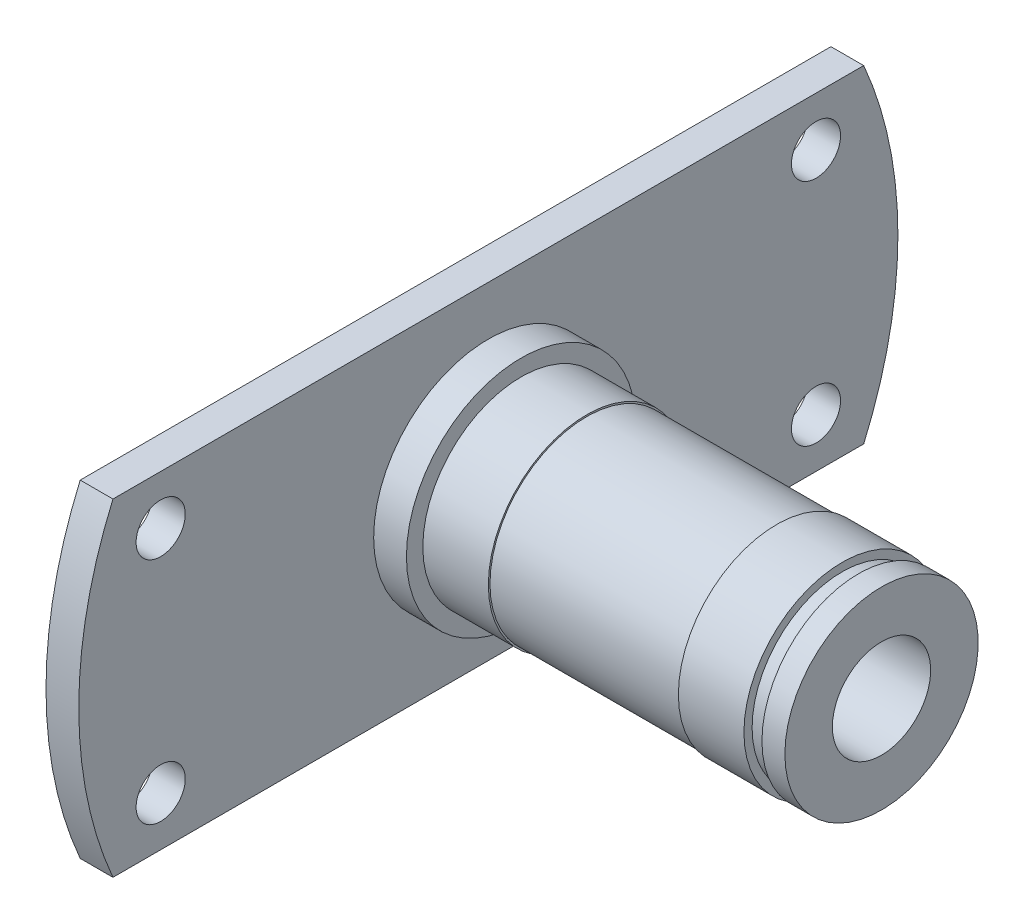
ISO-10303-21;
HEADER;
FILE_DESCRIPTION(('STEP AP214'),'2;1');
FILE_NAME('part.step','',(''),(''),'','','');
FILE_SCHEMA(('AUTOMOTIVE_DESIGN { 1 0 10303 214 1 1 1 1 }'));
ENDSEC;
DATA;
#1=APPLICATION_CONTEXT('core data for automotive mechanical design processes');
#2=APPLICATION_PROTOCOL_DEFINITION('international standard','automotive_design',2000,#1);
#3=PRODUCT_CONTEXT('',#1,'mechanical');
#4=PRODUCT('Part','Part','',(#3));
#5=PRODUCT_RELATED_PRODUCT_CATEGORY('part','',(#4));
#6=PRODUCT_DEFINITION_FORMATION('','',#4);
#7=PRODUCT_DEFINITION_CONTEXT('part definition',#1,'design');
#8=PRODUCT_DEFINITION('design','',#6,#7);
#9=PRODUCT_DEFINITION_SHAPE('','',#8);
#10=(LENGTH_UNIT() NAMED_UNIT(*) SI_UNIT(.MILLI.,.METRE.));
#11=(NAMED_UNIT(*) PLANE_ANGLE_UNIT() SI_UNIT($,.RADIAN.));
#12=(NAMED_UNIT(*) SI_UNIT($,.STERADIAN.) SOLID_ANGLE_UNIT());
#13=UNCERTAINTY_MEASURE_WITH_UNIT(LENGTH_MEASURE(1.E-05),#10,'distance_accuracy_value','');
#14=(GEOMETRIC_REPRESENTATION_CONTEXT(3) GLOBAL_UNCERTAINTY_ASSIGNED_CONTEXT((#13)) GLOBAL_UNIT_ASSIGNED_CONTEXT((#10,
#11,#12)) REPRESENTATION_CONTEXT('',''));
#15=CARTESIAN_POINT('',(0.,0.,0.));
#16=DIRECTION('',(0.,0.,1.));
#17=DIRECTION('',(1.,0.,0.));
#18=AXIS2_PLACEMENT_3D('',#15,#16,#17);
#19=CARTESIAN_POINT('',(-4.,0.,0.));
#20=DIRECTION('',(-1.,0.,0.));
#21=DIRECTION('',(0.,0.,1.));
#22=AXIS2_PLACEMENT_3D('',#19,#20,#21);
#23=PLANE('',#22);
#24=CARTESIAN_POINT('',(-4.,0.,0.));
#25=DIRECTION('',(-1.,0.,0.));
#26=DIRECTION('',(0.,0.,1.));
#27=AXIS2_PLACEMENT_3D('',#24,#25,#26);
#28=CIRCLE('',#27,3.);
#29=CARTESIAN_POINT('',(-4.,0.,3.));
#30=VERTEX_POINT('',#29);
#31=EDGE_CURVE('E435',#30,#30,#28,.T.);
#32=ORIENTED_EDGE('',*,*,#31,.F.);
#33=EDGE_LOOP('',(#32));
#34=FACE_BOUND('',#33,.T.);
#35=CARTESIAN_POINT('',(-4.,-7.,20.));
#36=DIRECTION('',(-1.,0.,0.));
#37=DIRECTION('',(0.,0.,1.));
#38=AXIS2_PLACEMENT_3D('',#35,#36,#37);
#39=CIRCLE('',#38,1.5);
#40=CARTESIAN_POINT('',(-4.,-7.,21.5));
#41=VERTEX_POINT('',#40);
#42=EDGE_CURVE('E397',#41,#41,#39,.T.);
#43=ORIENTED_EDGE('',*,*,#42,.F.);
#44=EDGE_LOOP('',(#43));
#45=FACE_BOUND('',#44,.T.);
#46=CARTESIAN_POINT('',(-4.,7.,-20.));
#47=DIRECTION('',(-1.,0.,0.));
#48=DIRECTION('',(0.,0.,1.));
#49=AXIS2_PLACEMENT_3D('',#46,#47,#48);
#50=CIRCLE('',#49,1.5);
#51=CARTESIAN_POINT('',(-4.,7.,-18.5));
#52=VERTEX_POINT('',#51);
#53=EDGE_CURVE('E103',#52,#52,#50,.T.);
#54=ORIENTED_EDGE('',*,*,#53,.F.);
#55=EDGE_LOOP('',(#54));
#56=FACE_BOUND('',#55,.T.);
#57=CARTESIAN_POINT('',(-4.,7.,20.));
#58=DIRECTION('',(-1.,0.,0.));
#59=DIRECTION('',(0.,0.,-1.));
#60=AXIS2_PLACEMENT_3D('',#57,#58,#59);
#61=CIRCLE('',#60,1.5);
#62=CARTESIAN_POINT('',(-4.,7.,18.5));
#63=VERTEX_POINT('',#62);
#64=EDGE_CURVE('E403',#63,#63,#61,.T.);
#65=ORIENTED_EDGE('',*,*,#64,.F.);
#66=EDGE_LOOP('',(#65));
#67=FACE_BOUND('',#66,.T.);
#68=CARTESIAN_POINT('',(-4.,-7.,-20.));
#69=DIRECTION('',(-1.,0.,0.));
#70=DIRECTION('',(0.,0.,-1.));
#71=AXIS2_PLACEMENT_3D('',#68,#69,#70);
#72=CIRCLE('',#71,1.5);
#73=CARTESIAN_POINT('',(-4.,-7.,-21.5));
#74=VERTEX_POINT('',#73);
#75=EDGE_CURVE('E391',#74,#74,#72,.T.);
#76=ORIENTED_EDGE('',*,*,#75,.F.);
#77=EDGE_LOOP('',(#76));
#78=FACE_BOUND('',#77,.T.);
#79=CARTESIAN_POINT('',(-4.,0.,0.));
#80=DIRECTION('',(-1.,0.,0.));
#81=DIRECTION('',(0.,0.,1.));
#82=AXIS2_PLACEMENT_3D('',#79,#80,#81);
#83=CIRCLE('',#82,25.);
#84=CARTESIAN_POINT('',(-4.,10.,-22.9128784747792));
#85=VERTEX_POINT('',#84);
#86=CARTESIAN_POINT('',(-4.,-10.,-22.9128784747792));
#87=VERTEX_POINT('',#86);
#88=EDGE_CURVE('E101',#85,#87,#83,.T.);
#89=ORIENTED_EDGE('',*,*,#88,.T.);
#90=DIRECTION('',(0.,0.,-1.));
#91=VECTOR('',#90,1.);
#92=CARTESIAN_POINT('',(-4.,-10.,22.9128784747792));
#93=LINE('',#92,#91);
#94=CARTESIAN_POINT('',(-4.,-10.,22.9128784747792));
#95=VERTEX_POINT('',#94);
#96=EDGE_CURVE('E80',#95,#87,#93,.T.);
#97=ORIENTED_EDGE('',*,*,#96,.F.);
#98=CARTESIAN_POINT('',(-4.,10.,22.9128784747792));
#99=VERTEX_POINT('',#98);
#100=EDGE_CURVE('E60',#95,#99,#83,.T.);
#101=ORIENTED_EDGE('',*,*,#100,.T.);
#102=DIRECTION('',(0.,0.,-1.));
#103=VECTOR('',#102,1.);
#104=CARTESIAN_POINT('',(-4.,10.,22.9128784747792));
#105=LINE('',#104,#103);
#106=EDGE_CURVE('E388',#99,#85,#105,.T.);
#107=ORIENTED_EDGE('',*,*,#106,.T.);
#108=EDGE_LOOP('',(#89,#97,#101,#107));
#109=FACE_BOUND('',#108,.T.);
#110=ADVANCED_FACE('F37',(#34,#45,#56,#67,#78,#109),#23,.T.);
#111=CARTESIAN_POINT('',(-2.,0.,0.));
#112=DIRECTION('',(-1.,0.,0.));
#113=DIRECTION('',(0.,0.,1.));
#114=AXIS2_PLACEMENT_3D('',#111,#112,#113);
#115=PLANE('',#114);
#116=CARTESIAN_POINT('',(-2.,-7.,-20.));
#117=DIRECTION('',(-1.,0.,0.));
#118=DIRECTION('',(0.,0.,-1.));
#119=AXIS2_PLACEMENT_3D('',#116,#117,#118);
#120=CIRCLE('',#119,1.5);
#121=CARTESIAN_POINT('',(-2.,-7.,-21.5));
#122=VERTEX_POINT('',#121);
#123=EDGE_CURVE('E390',#122,#122,#120,.T.);
#124=ORIENTED_EDGE('',*,*,#123,.T.);
#125=EDGE_LOOP('',(#124));
#126=FACE_BOUND('',#125,.T.);
#127=CARTESIAN_POINT('',(-2.,-7.,20.));
#128=DIRECTION('',(-1.,0.,0.));
#129=DIRECTION('',(0.,0.,1.));
#130=AXIS2_PLACEMENT_3D('',#127,#128,#129);
#131=CIRCLE('',#130,1.5);
#132=CARTESIAN_POINT('',(-2.,-7.,21.5));
#133=VERTEX_POINT('',#132);
#134=EDGE_CURVE('E394',#133,#133,#131,.T.);
#135=ORIENTED_EDGE('',*,*,#134,.T.);
#136=EDGE_LOOP('',(#135));
#137=FACE_BOUND('',#136,.T.);
#138=CARTESIAN_POINT('',(-2.,7.,20.));
#139=DIRECTION('',(-1.,0.,0.));
#140=DIRECTION('',(0.,0.,-1.));
#141=AXIS2_PLACEMENT_3D('',#138,#139,#140);
#142=CIRCLE('',#141,1.5);
#143=CARTESIAN_POINT('',(-2.,7.,18.5));
#144=VERTEX_POINT('',#143);
#145=EDGE_CURVE('E400',#144,#144,#142,.T.);
#146=ORIENTED_EDGE('',*,*,#145,.T.);
#147=EDGE_LOOP('',(#146));
#148=FACE_BOUND('',#147,.T.);
#149=CARTESIAN_POINT('',(-2.,7.,-20.));
#150=DIRECTION('',(-1.,0.,0.));
#151=DIRECTION('',(0.,0.,1.));
#152=AXIS2_PLACEMENT_3D('',#149,#150,#151);
#153=CIRCLE('',#152,1.5);
#154=CARTESIAN_POINT('',(-2.,7.,-18.5));
#155=VERTEX_POINT('',#154);
#156=EDGE_CURVE('E406',#155,#155,#153,.T.);
#157=ORIENTED_EDGE('',*,*,#156,.T.);
#158=EDGE_LOOP('',(#157));
#159=FACE_BOUND('',#158,.T.);
#160=CARTESIAN_POINT('',(-2.,0.,0.));
#161=DIRECTION('',(-1.,0.,0.));
#162=DIRECTION('',(0.,0.,1.));
#163=AXIS2_PLACEMENT_3D('',#160,#161,#162);
#164=CIRCLE('',#163,7.);
#165=CARTESIAN_POINT('',(-2.,0.,7.));
#166=VERTEX_POINT('',#165);
#167=EDGE_CURVE('E106',#166,#166,#164,.T.);
#168=ORIENTED_EDGE('',*,*,#167,.T.);
#169=EDGE_LOOP('',(#168));
#170=FACE_BOUND('',#169,.T.);
#171=DIRECTION('',(0.,0.,-1.));
#172=VECTOR('',#171,1.);
#173=CARTESIAN_POINT('',(-2.,-10.,22.9128784747792));
#174=LINE('',#173,#172);
#175=CARTESIAN_POINT('',(-2.,-10.,22.9128784747792));
#176=VERTEX_POINT('',#175);
#177=CARTESIAN_POINT('',(-2.,-10.,-22.9128784747792));
#178=VERTEX_POINT('',#177);
#179=EDGE_CURVE('E52',#176,#178,#174,.T.);
#180=ORIENTED_EDGE('',*,*,#179,.T.);
#181=CARTESIAN_POINT('',(-2.,0.,0.));
#182=DIRECTION('',(-1.,0.,0.));
#183=DIRECTION('',(0.,0.,1.));
#184=AXIS2_PLACEMENT_3D('',#181,#182,#183);
#185=CIRCLE('',#184,25.);
#186=CARTESIAN_POINT('',(-2.,10.,-22.9128784747792));
#187=VERTEX_POINT('',#186);
#188=EDGE_CURVE('E93',#187,#178,#185,.T.);
#189=ORIENTED_EDGE('',*,*,#188,.F.);
#190=DIRECTION('',(0.,0.,-1.));
#191=VECTOR('',#190,1.);
#192=CARTESIAN_POINT('',(-2.,10.,22.9128784747792));
#193=LINE('',#192,#191);
#194=CARTESIAN_POINT('',(-2.,10.,22.9128784747792));
#195=VERTEX_POINT('',#194);
#196=EDGE_CURVE('E386',#195,#187,#193,.T.);
#197=ORIENTED_EDGE('',*,*,#196,.F.);
#198=EDGE_CURVE('E94',#176,#195,#185,.T.);
#199=ORIENTED_EDGE('',*,*,#198,.F.);
#200=EDGE_LOOP('',(#180,#189,#197,#199));
#201=FACE_BOUND('',#200,.T.);
#202=ADVANCED_FACE('F91',(#126,#137,#148,#159,#170,#201),#115,.F.);
#203=CARTESIAN_POINT('',(-4.,0.,0.));
#204=DIRECTION('',(1.,0.,0.));
#205=DIRECTION('',(0.,0.,-1.));
#206=AXIS2_PLACEMENT_3D('',#203,#204,#205);
#207=CYLINDRICAL_SURFACE('',#206,25.);
#208=DIRECTION('',(1.,0.,0.));
#209=VECTOR('',#208,1.);
#210=CARTESIAN_POINT('',(-4.,-10.,-22.9128784747792));
#211=LINE('',#210,#209);
#212=EDGE_CURVE('E78',#178,#87,#211,.F.);
#213=ORIENTED_EDGE('',*,*,#212,.T.);
#214=ORIENTED_EDGE('',*,*,#88,.F.);
#215=DIRECTION('',(1.,0.,0.));
#216=VECTOR('',#215,1.);
#217=CARTESIAN_POINT('',(-4.,10.,-22.9128784747792));
#218=LINE('',#217,#216);
#219=EDGE_CURVE('E99',#187,#85,#218,.F.);
#220=ORIENTED_EDGE('',*,*,#219,.F.);
#221=ORIENTED_EDGE('',*,*,#188,.T.);
#222=EDGE_LOOP('',(#213,#214,#220,#221));
#223=FACE_BOUND('',#222,.T.);
#224=ADVANCED_FACE('F98',(#223),#207,.T.);
#225=DIRECTION('',(1.,0.,0.));
#226=VECTOR('',#225,1.);
#227=CARTESIAN_POINT('',(-4.,-10.,22.9128784747792));
#228=LINE('',#227,#226);
#229=EDGE_CURVE('E85',#95,#176,#228,.T.);
#230=ORIENTED_EDGE('',*,*,#229,.T.);
#231=ORIENTED_EDGE('',*,*,#198,.T.);
#232=DIRECTION('',(1.,0.,0.));
#233=VECTOR('',#232,1.);
#234=CARTESIAN_POINT('',(-4.,10.,22.9128784747792));
#235=LINE('',#234,#233);
#236=EDGE_CURVE('E95',#99,#195,#235,.T.);
#237=ORIENTED_EDGE('',*,*,#236,.F.);
#238=ORIENTED_EDGE('',*,*,#100,.F.);
#239=EDGE_LOOP('',(#230,#231,#237,#238));
#240=FACE_BOUND('',#239,.T.);
#241=ADVANCED_FACE('F150',(#240),#207,.T.);
#242=CARTESIAN_POINT('',(22.,0.,0.));
#243=DIRECTION('',(1.,0.,0.));
#244=DIRECTION('',(0.,0.,-1.));
#245=AXIS2_PLACEMENT_3D('',#242,#243,#244);
#246=PLANE('',#245);
#247=CARTESIAN_POINT('',(22.,0.,0.));
#248=DIRECTION('',(-1.,0.,0.));
#249=DIRECTION('',(0.,0.,1.));
#250=AXIS2_PLACEMENT_3D('',#247,#248,#249);
#251=CIRCLE('',#250,2.99999999999999);
#252=CARTESIAN_POINT('',(22.,0.,2.99999999999999));
#253=VERTEX_POINT('',#252);
#254=EDGE_CURVE('E86',#253,#253,#251,.T.);
#255=ORIENTED_EDGE('',*,*,#254,.T.);
#256=EDGE_LOOP('',(#255));
#257=FACE_BOUND('',#256,.T.);
#258=CARTESIAN_POINT('',(22.,0.,0.));
#259=DIRECTION('',(-1.,0.,0.));
#260=DIRECTION('',(0.,0.,1.));
#261=AXIS2_PLACEMENT_3D('',#258,#259,#260);
#262=CIRCLE('',#261,5.9);
#263=CARTESIAN_POINT('',(22.,0.,5.9));
#264=VERTEX_POINT('',#263);
#265=EDGE_CURVE('E11',#264,#264,#262,.T.);
#266=ORIENTED_EDGE('',*,*,#265,.F.);
#267=EDGE_LOOP('',(#266));
#268=FACE_BOUND('',#267,.T.);
#269=ADVANCED_FACE('F39',(#257,#268),#246,.T.);
#270=CARTESIAN_POINT('',(-38.405203889765,0.,0.));
#271=DIRECTION('',(-1.,0.,0.));
#272=DIRECTION('',(0.,0.,1.));
#273=AXIS2_PLACEMENT_3D('',#270,#271,#272);
#274=CYLINDRICAL_SURFACE('',#273,5.9);
#275=ORIENTED_EDGE('',*,*,#265,.T.);
#276=EDGE_LOOP('',(#275));
#277=FACE_BOUND('',#276,.T.);
#278=CARTESIAN_POINT('',(20.6,0.,0.));
#279=DIRECTION('',(-1.,0.,0.));
#280=DIRECTION('',(0.,0.,1.));
#281=AXIS2_PLACEMENT_3D('',#278,#279,#280);
#282=CIRCLE('',#281,5.9);
#283=CARTESIAN_POINT('',(20.6,0.,5.9));
#284=VERTEX_POINT('',#283);
#285=EDGE_CURVE('E45',#284,#284,#282,.T.);
#286=ORIENTED_EDGE('',*,*,#285,.F.);
#287=EDGE_LOOP('',(#286));
#288=FACE_BOUND('',#287,.T.);
#289=ADVANCED_FACE('F141',(#277,#288),#274,.T.);
#290=CARTESIAN_POINT('',(20.6,0.,0.));
#291=DIRECTION('',(-1.,0.,0.));
#292=DIRECTION('',(0.,0.,1.));
#293=AXIS2_PLACEMENT_3D('',#290,#291,#292);
#294=PLANE('',#293);
#295=ORIENTED_EDGE('',*,*,#285,.T.);
#296=EDGE_LOOP('',(#295));
#297=FACE_BOUND('',#296,.T.);
#298=CARTESIAN_POINT('',(20.6,0.,0.));
#299=DIRECTION('',(-1.,0.,0.));
#300=DIRECTION('',(0.,0.,1.));
#301=AXIS2_PLACEMENT_3D('',#298,#299,#300);
#302=CIRCLE('',#301,5.5);
#303=CARTESIAN_POINT('',(20.6,0.,5.5));
#304=VERTEX_POINT('',#303);
#305=EDGE_CURVE('E133',#304,#304,#302,.T.);
#306=ORIENTED_EDGE('',*,*,#305,.F.);
#307=EDGE_LOOP('',(#306));
#308=FACE_BOUND('',#307,.T.);
#309=ADVANCED_FACE('F138',(#297,#308),#294,.T.);
#310=CARTESIAN_POINT('',(-38.405203889765,0.,0.));
#311=DIRECTION('',(-1.,0.,0.));
#312=DIRECTION('',(0.,0.,1.));
#313=AXIS2_PLACEMENT_3D('',#310,#311,#312);
#314=CYLINDRICAL_SURFACE('',#313,5.5);
#315=ORIENTED_EDGE('',*,*,#305,.T.);
#316=EDGE_LOOP('',(#315));
#317=FACE_BOUND('',#316,.T.);
#318=CARTESIAN_POINT('',(19.6,0.,0.));
#319=DIRECTION('',(-1.,0.,0.));
#320=DIRECTION('',(0.,0.,1.));
#321=AXIS2_PLACEMENT_3D('',#318,#319,#320);
#322=CIRCLE('',#321,5.5);
#323=CARTESIAN_POINT('',(19.6,0.,5.5));
#324=VERTEX_POINT('',#323);
#325=EDGE_CURVE('E130',#324,#324,#322,.T.);
#326=ORIENTED_EDGE('',*,*,#325,.F.);
#327=EDGE_LOOP('',(#326));
#328=FACE_BOUND('',#327,.T.);
#329=ADVANCED_FACE('F148',(#317,#328),#314,.T.);
#330=CARTESIAN_POINT('',(19.6,0.,0.));
#331=DIRECTION('',(1.,0.,0.));
#332=DIRECTION('',(0.,0.,-1.));
#333=AXIS2_PLACEMENT_3D('',#330,#331,#332);
#334=PLANE('',#333);
#335=ORIENTED_EDGE('',*,*,#325,.T.);
#336=EDGE_LOOP('',(#335));
#337=FACE_BOUND('',#336,.T.);
#338=CARTESIAN_POINT('',(19.6,0.,0.));
#339=DIRECTION('',(-1.,0.,0.));
#340=DIRECTION('',(0.,0.,1.));
#341=AXIS2_PLACEMENT_3D('',#338,#339,#340);
#342=CIRCLE('',#341,6.);
#343=CARTESIAN_POINT('',(19.6,0.,6.));
#344=VERTEX_POINT('',#343);
#345=EDGE_CURVE('E127',#344,#344,#342,.T.);
#346=ORIENTED_EDGE('',*,*,#345,.F.);
#347=EDGE_LOOP('',(#346));
#348=FACE_BOUND('',#347,.T.);
#349=ADVANCED_FACE('F195',(#337,#348),#334,.T.);
#350=CARTESIAN_POINT('',(-38.405203889765,0.,0.));
#351=DIRECTION('',(-1.,0.,0.));
#352=DIRECTION('',(0.,0.,1.));
#353=AXIS2_PLACEMENT_3D('',#350,#351,#352);
#354=CYLINDRICAL_SURFACE('',#353,6.);
#355=ORIENTED_EDGE('',*,*,#345,.T.);
#356=EDGE_LOOP('',(#355));
#357=FACE_BOUND('',#356,.T.);
#358=CARTESIAN_POINT('',(15.6,0.,0.));
#359=DIRECTION('',(-1.,0.,0.));
#360=DIRECTION('',(0.,0.,1.));
#361=AXIS2_PLACEMENT_3D('',#358,#359,#360);
#362=CIRCLE('',#361,6.);
#363=CARTESIAN_POINT('',(15.6,0.,6.));
#364=VERTEX_POINT('',#363);
#365=EDGE_CURVE('E124',#364,#364,#362,.T.);
#366=ORIENTED_EDGE('',*,*,#365,.F.);
#367=EDGE_LOOP('',(#366));
#368=FACE_BOUND('',#367,.T.);
#369=ADVANCED_FACE('F191',(#357,#368),#354,.T.);
#370=CARTESIAN_POINT('',(15.6,0.,0.));
#371=DIRECTION('',(-1.,0.,0.));
#372=DIRECTION('',(0.,0.,1.));
#373=AXIS2_PLACEMENT_3D('',#370,#371,#372);
#374=PLANE('',#373);
#375=ORIENTED_EDGE('',*,*,#365,.T.);
#376=EDGE_LOOP('',(#375));
#377=FACE_BOUND('',#376,.T.);
#378=CARTESIAN_POINT('',(15.6,0.,0.));
#379=DIRECTION('',(-1.,0.,0.));
#380=DIRECTION('',(0.,0.,1.));
#381=AXIS2_PLACEMENT_3D('',#378,#379,#380);
#382=CIRCLE('',#381,5.9);
#383=CARTESIAN_POINT('',(15.6,0.,5.9));
#384=VERTEX_POINT('',#383);
#385=EDGE_CURVE('E121',#384,#384,#382,.T.);
#386=ORIENTED_EDGE('',*,*,#385,.F.);
#387=EDGE_LOOP('',(#386));
#388=FACE_BOUND('',#387,.T.);
#389=ADVANCED_FACE('F187',(#377,#388),#374,.T.);
#390=CARTESIAN_POINT('',(-38.405203889765,0.,0.));
#391=DIRECTION('',(-1.,0.,0.));
#392=DIRECTION('',(0.,0.,1.));
#393=AXIS2_PLACEMENT_3D('',#390,#391,#392);
#394=CYLINDRICAL_SURFACE('',#393,5.9);
#395=ORIENTED_EDGE('',*,*,#385,.T.);
#396=EDGE_LOOP('',(#395));
#397=FACE_BOUND('',#396,.T.);
#398=CARTESIAN_POINT('',(4.,0.,0.));
#399=DIRECTION('',(-1.,0.,0.));
#400=DIRECTION('',(0.,0.,1.));
#401=AXIS2_PLACEMENT_3D('',#398,#399,#400);
#402=CIRCLE('',#401,5.9);
#403=CARTESIAN_POINT('',(4.,0.,5.9));
#404=VERTEX_POINT('',#403);
#405=EDGE_CURVE('E118',#404,#404,#402,.T.);
#406=ORIENTED_EDGE('',*,*,#405,.F.);
#407=EDGE_LOOP('',(#406));
#408=FACE_BOUND('',#407,.T.);
#409=ADVANCED_FACE('F183',(#397,#408),#394,.T.);
#410=CARTESIAN_POINT('',(4.,0.,0.));
#411=DIRECTION('',(1.,0.,0.));
#412=DIRECTION('',(0.,0.,-1.));
#413=AXIS2_PLACEMENT_3D('',#410,#411,#412);
#414=PLANE('',#413);
#415=ORIENTED_EDGE('',*,*,#405,.T.);
#416=EDGE_LOOP('',(#415));
#417=FACE_BOUND('',#416,.T.);
#418=CARTESIAN_POINT('',(4.,0.,0.));
#419=DIRECTION('',(-1.,0.,0.));
#420=DIRECTION('',(0.,0.,1.));
#421=AXIS2_PLACEMENT_3D('',#418,#419,#420);
#422=CIRCLE('',#421,6.);
#423=CARTESIAN_POINT('',(4.,0.,6.));
#424=VERTEX_POINT('',#423);
#425=EDGE_CURVE('E115',#424,#424,#422,.T.);
#426=ORIENTED_EDGE('',*,*,#425,.F.);
#427=EDGE_LOOP('',(#426));
#428=FACE_BOUND('',#427,.T.);
#429=ADVANCED_FACE('F179',(#417,#428),#414,.T.);
#430=CARTESIAN_POINT('',(-38.405203889765,0.,0.));
#431=DIRECTION('',(-1.,0.,0.));
#432=DIRECTION('',(0.,0.,1.));
#433=AXIS2_PLACEMENT_3D('',#430,#431,#432);
#434=CYLINDRICAL_SURFACE('',#433,6.);
#435=ORIENTED_EDGE('',*,*,#425,.T.);
#436=EDGE_LOOP('',(#435));
#437=FACE_BOUND('',#436,.T.);
#438=CARTESIAN_POINT('',(0.,0.,0.));
#439=DIRECTION('',(-1.,0.,0.));
#440=DIRECTION('',(0.,0.,1.));
#441=AXIS2_PLACEMENT_3D('',#438,#439,#440);
#442=CIRCLE('',#441,6.);
#443=CARTESIAN_POINT('',(0.,0.,6.));
#444=VERTEX_POINT('',#443);
#445=EDGE_CURVE('E112',#444,#444,#442,.T.);
#446=ORIENTED_EDGE('',*,*,#445,.F.);
#447=EDGE_LOOP('',(#446));
#448=FACE_BOUND('',#447,.T.);
#449=ADVANCED_FACE('F175',(#437,#448),#434,.T.);
#450=CARTESIAN_POINT('',(0.,0.,0.));
#451=DIRECTION('',(-1.,0.,0.));
#452=DIRECTION('',(0.,0.,1.));
#453=AXIS2_PLACEMENT_3D('',#450,#451,#452);
#454=PLANE('',#453);
#455=CARTESIAN_POINT('',(0.,0.,0.));
#456=DIRECTION('',(-1.,0.,0.));
#457=DIRECTION('',(0.,0.,1.));
#458=AXIS2_PLACEMENT_3D('',#455,#456,#457);
#459=CIRCLE('',#458,7.);
#460=CARTESIAN_POINT('',(0.,0.,7.));
#461=VERTEX_POINT('',#460);
#462=EDGE_CURVE('E109',#461,#461,#459,.T.);
#463=ORIENTED_EDGE('',*,*,#462,.F.);
#464=EDGE_LOOP('',(#463));
#465=FACE_BOUND('',#464,.T.);
#466=ORIENTED_EDGE('',*,*,#445,.T.);
#467=EDGE_LOOP('',(#466));
#468=FACE_BOUND('',#467,.T.);
#469=ADVANCED_FACE('F171',(#465,#468),#454,.F.);
#470=CARTESIAN_POINT('',(-38.405203889765,0.,0.));
#471=DIRECTION('',(-1.,0.,0.));
#472=DIRECTION('',(0.,0.,1.));
#473=AXIS2_PLACEMENT_3D('',#470,#471,#472);
#474=CYLINDRICAL_SURFACE('',#473,7.);
#475=ORIENTED_EDGE('',*,*,#167,.F.);
#476=EDGE_LOOP('',(#475));
#477=FACE_BOUND('',#476,.T.);
#478=ORIENTED_EDGE('',*,*,#462,.T.);
#479=EDGE_LOOP('',(#478));
#480=FACE_BOUND('',#479,.T.);
#481=ADVANCED_FACE('F168',(#477,#480),#474,.T.);
#482=CARTESIAN_POINT('',(-4.,7.,-20.));
#483=DIRECTION('',(1.,0.,0.));
#484=DIRECTION('',(0.,0.,-1.));
#485=AXIS2_PLACEMENT_3D('',#482,#483,#484);
#486=CYLINDRICAL_SURFACE('',#485,1.5);
#487=ORIENTED_EDGE('',*,*,#53,.T.);
#488=EDGE_LOOP('',(#487));
#489=FACE_BOUND('',#488,.T.);
#490=ORIENTED_EDGE('',*,*,#156,.F.);
#491=EDGE_LOOP('',(#490));
#492=FACE_BOUND('',#491,.T.);
#493=ADVANCED_FACE('F163',(#489,#492),#486,.F.);
#494=CARTESIAN_POINT('',(-4.,7.,20.));
#495=DIRECTION('',(1.,0.,0.));
#496=DIRECTION('',(0.,0.,-1.));
#497=AXIS2_PLACEMENT_3D('',#494,#495,#496);
#498=CYLINDRICAL_SURFACE('',#497,1.5);
#499=ORIENTED_EDGE('',*,*,#64,.T.);
#500=EDGE_LOOP('',(#499));
#501=FACE_BOUND('',#500,.T.);
#502=ORIENTED_EDGE('',*,*,#145,.F.);
#503=EDGE_LOOP('',(#502));
#504=FACE_BOUND('',#503,.T.);
#505=ADVANCED_FACE('F260',(#501,#504),#498,.F.);
#506=CARTESIAN_POINT('',(-4.,-7.,20.));
#507=DIRECTION('',(1.,0.,0.));
#508=DIRECTION('',(0.,0.,-1.));
#509=AXIS2_PLACEMENT_3D('',#506,#507,#508);
#510=CYLINDRICAL_SURFACE('',#509,1.5);
#511=ORIENTED_EDGE('',*,*,#42,.T.);
#512=EDGE_LOOP('',(#511));
#513=FACE_BOUND('',#512,.T.);
#514=ORIENTED_EDGE('',*,*,#134,.F.);
#515=EDGE_LOOP('',(#514));
#516=FACE_BOUND('',#515,.T.);
#517=ADVANCED_FACE('F267',(#513,#516),#510,.F.);
#518=CARTESIAN_POINT('',(-4.,-7.,-20.));
#519=DIRECTION('',(1.,0.,0.));
#520=DIRECTION('',(0.,0.,-1.));
#521=AXIS2_PLACEMENT_3D('',#518,#519,#520);
#522=CYLINDRICAL_SURFACE('',#521,1.5);
#523=ORIENTED_EDGE('',*,*,#75,.T.);
#524=EDGE_LOOP('',(#523));
#525=FACE_BOUND('',#524,.T.);
#526=ORIENTED_EDGE('',*,*,#123,.F.);
#527=EDGE_LOOP('',(#526));
#528=FACE_BOUND('',#527,.T.);
#529=ADVANCED_FACE('F274',(#525,#528),#522,.F.);
#530=CARTESIAN_POINT('',(-4.001,10.,22.9128784747792));
#531=DIRECTION('',(0.,-1.,0.));
#532=DIRECTION('',(0.,0.,-1.));
#533=AXIS2_PLACEMENT_3D('',#530,#531,#532);
#534=PLANE('',#533);
#535=ORIENTED_EDGE('',*,*,#236,.T.);
#536=ORIENTED_EDGE('',*,*,#196,.T.);
#537=ORIENTED_EDGE('',*,*,#219,.T.);
#538=ORIENTED_EDGE('',*,*,#106,.F.);
#539=EDGE_LOOP('',(#535,#536,#537,#538));
#540=FACE_BOUND('',#539,.T.);
#541=ADVANCED_FACE('F282',(#540),#534,.F.);
#542=CARTESIAN_POINT('',(-4.001,-10.,22.9128784747792));
#543=DIRECTION('',(0.,-1.,0.));
#544=DIRECTION('',(0.,0.,-1.));
#545=AXIS2_PLACEMENT_3D('',#542,#543,#544);
#546=PLANE('',#545);
#547=ORIENTED_EDGE('',*,*,#96,.T.);
#548=ORIENTED_EDGE('',*,*,#212,.F.);
#549=ORIENTED_EDGE('',*,*,#179,.F.);
#550=ORIENTED_EDGE('',*,*,#229,.F.);
#551=EDGE_LOOP('',(#547,#548,#549,#550));
#552=FACE_BOUND('',#551,.T.);
#553=ADVANCED_FACE('F79',(#552),#546,.T.);
#554=CARTESIAN_POINT('',(-4.,0.,0.));
#555=DIRECTION('',(-1.,0.,0.));
#556=DIRECTION('',(0.,0.,1.));
#557=AXIS2_PLACEMENT_3D('',#554,#555,#556);
#558=CYLINDRICAL_SURFACE('',#557,3.);
#559=ORIENTED_EDGE('',*,*,#254,.F.);
#560=EDGE_LOOP('',(#559));
#561=FACE_BOUND('',#560,.T.);
#562=ORIENTED_EDGE('',*,*,#31,.T.);
#563=EDGE_LOOP('',(#562));
#564=FACE_BOUND('',#563,.T.);
#565=ADVANCED_FACE('F298',(#561,#564),#558,.F.);
#566=CLOSED_SHELL('',(#110,#202,#224,#241,#269,#289,#309,#329,#349,#369,#389,#409,#429,#449,
#469,#481,#493,#505,#517,#529,#541,#553,#565));
#567=MANIFOLD_SOLID_BREP('B2',#566);
#568=ADVANCED_BREP_SHAPE_REPRESENTATION('',(#18,#567),#14);
#569=SHAPE_DEFINITION_REPRESENTATION(#9,#568);
ENDSEC;
END-ISO-10303-21;
